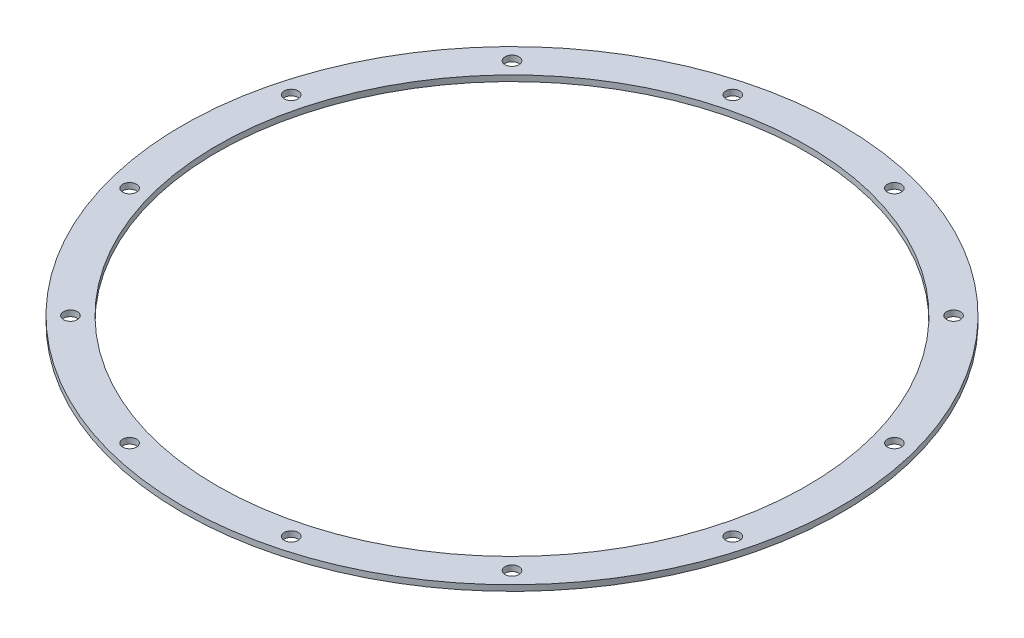
ISO-10303-21;
HEADER;
FILE_DESCRIPTION(('STEP AP214'),'2;1');
FILE_NAME('part.step','',(''),(''),'','','');
FILE_SCHEMA(('AUTOMOTIVE_DESIGN { 1 0 10303 214 1 1 1 1 }'));
ENDSEC;
DATA;
#1=APPLICATION_CONTEXT('core data for automotive mechanical design processes');
#2=APPLICATION_PROTOCOL_DEFINITION('international standard','automotive_design',2000,#1);
#3=PRODUCT_CONTEXT('',#1,'mechanical');
#4=PRODUCT('Part','Part','',(#3));
#5=PRODUCT_RELATED_PRODUCT_CATEGORY('part','',(#4));
#6=PRODUCT_DEFINITION_FORMATION('','',#4);
#7=PRODUCT_DEFINITION_CONTEXT('part definition',#1,'design');
#8=PRODUCT_DEFINITION('design','',#6,#7);
#9=PRODUCT_DEFINITION_SHAPE('','',#8);
#10=(LENGTH_UNIT() NAMED_UNIT(*) SI_UNIT(.MILLI.,.METRE.));
#11=(NAMED_UNIT(*) PLANE_ANGLE_UNIT() SI_UNIT($,.RADIAN.));
#12=(NAMED_UNIT(*) SI_UNIT($,.STERADIAN.) SOLID_ANGLE_UNIT());
#13=UNCERTAINTY_MEASURE_WITH_UNIT(LENGTH_MEASURE(1.E-05),#10,'distance_accuracy_value','');
#14=(GEOMETRIC_REPRESENTATION_CONTEXT(3) GLOBAL_UNCERTAINTY_ASSIGNED_CONTEXT((#13)) GLOBAL_UNIT_ASSIGNED_CONTEXT((#10,
#11,#12)) REPRESENTATION_CONTEXT('',''));
#15=CARTESIAN_POINT('',(0.,0.,0.));
#16=DIRECTION('',(0.,0.,1.));
#17=DIRECTION('',(1.,0.,0.));
#18=AXIS2_PLACEMENT_3D('',#15,#16,#17);
#19=CARTESIAN_POINT('',(0.,2.5,0.));
#20=DIRECTION('',(0.,1.,0.));
#21=DIRECTION('',(0.,0.,1.));
#22=AXIS2_PLACEMENT_3D('',#19,#20,#21);
#23=PLANE('',#22);
#24=CARTESIAN_POINT('',(-190.918830920357,2.5,190.918830920365));
#25=DIRECTION('',(0.,1.,0.));
#26=DIRECTION('',(0.,0.,1.));
#27=AXIS2_PLACEMENT_3D('',#24,#25,#26);
#28=CIRCLE('',#27,5.9999999999965);
#29=CARTESIAN_POINT('',(-190.918830920357,2.5,196.918830920362));
#30=VERTEX_POINT('',#29);
#31=EDGE_CURVE('E108',#30,#30,#28,.T.);
#32=ORIENTED_EDGE('',*,*,#31,.F.);
#33=EDGE_LOOP('',(#32));
#34=FACE_BOUND('',#33,.T.);
#35=CARTESIAN_POINT('',(69.8811421776947,2.5,260.799973098035));
#36=DIRECTION('',(0.,1.,0.));
#37=DIRECTION('',(0.,0.,1.));
#38=AXIS2_PLACEMENT_3D('',#35,#36,#37);
#39=CIRCLE('',#38,6.00000000000223);
#40=CARTESIAN_POINT('',(69.8811421776947,2.5,266.799973098037));
#41=VERTEX_POINT('',#40);
#42=EDGE_CURVE('E96',#41,#41,#39,.T.);
#43=ORIENTED_EDGE('',*,*,#42,.F.);
#44=EDGE_LOOP('',(#43));
#45=FACE_BOUND('',#44,.T.);
#46=CARTESIAN_POINT('',(260.799973098055,2.5,69.8811421776587));
#47=DIRECTION('',(0.,1.,0.));
#48=DIRECTION('',(0.,0.,1.));
#49=AXIS2_PLACEMENT_3D('',#46,#47,#48);
#50=CIRCLE('',#49,6.00000000001319);
#51=CARTESIAN_POINT('',(260.799973098055,2.5,75.8811421776718));
#52=VERTEX_POINT('',#51);
#53=EDGE_CURVE('E84',#52,#52,#50,.T.);
#54=ORIENTED_EDGE('',*,*,#53,.F.);
#55=EDGE_LOOP('',(#54));
#56=FACE_BOUND('',#55,.T.);
#57=CARTESIAN_POINT('',(190.918830920363,2.5,-190.918830920387));
#58=DIRECTION('',(0.,1.,0.));
#59=DIRECTION('',(0.,0.,1.));
#60=AXIS2_PLACEMENT_3D('',#57,#58,#59);
#61=CIRCLE('',#60,6.00000000001827);
#62=CARTESIAN_POINT('',(190.918830920363,2.5,-184.918830920369));
#63=VERTEX_POINT('',#62);
#64=EDGE_CURVE('E72',#63,#63,#61,.T.);
#65=ORIENTED_EDGE('',*,*,#64,.F.);
#66=EDGE_LOOP('',(#65));
#67=FACE_BOUND('',#66,.T.);
#68=CARTESIAN_POINT('',(-69.8811421776885,2.5,-260.799973098057));
#69=DIRECTION('',(0.,1.,0.));
#70=DIRECTION('',(0.,0.,1.));
#71=AXIS2_PLACEMENT_3D('',#68,#69,#70);
#72=CIRCLE('',#71,6.00000000001176);
#73=CARTESIAN_POINT('',(-69.8811421776885,2.5,-254.799973098045));
#74=VERTEX_POINT('',#73);
#75=EDGE_CURVE('E60',#74,#74,#72,.T.);
#76=ORIENTED_EDGE('',*,*,#75,.F.);
#77=EDGE_LOOP('',(#76));
#78=FACE_BOUND('',#77,.T.);
#79=CARTESIAN_POINT('',(-260.799973098048,2.5,-69.8811421776808));
#80=DIRECTION('',(0.,1.,0.));
#81=DIRECTION('',(0.,0.,1.));
#82=AXIS2_PLACEMENT_3D('',#79,#80,#81);
#83=CIRCLE('',#82,5.99999999999999);
#84=CARTESIAN_POINT('',(-260.799973098048,2.5,-63.8811421776808));
#85=VERTEX_POINT('',#84);
#86=EDGE_CURVE('E48',#85,#85,#83,.T.);
#87=ORIENTED_EDGE('',*,*,#86,.F.);
#88=EDGE_LOOP('',(#87));
#89=FACE_BOUND('',#88,.T.);
#90=CARTESIAN_POINT('',(0.,2.5,0.));
#91=DIRECTION('',(0.,1.,0.));
#92=DIRECTION('',(0.,0.,1.));
#93=AXIS2_PLACEMENT_3D('',#90,#91,#92);
#94=CIRCLE('',#93,285.);
#95=CARTESIAN_POINT('',(0.,2.5,285.));
#96=VERTEX_POINT('',#95);
#97=EDGE_CURVE('E10',#96,#96,#94,.T.);
#98=ORIENTED_EDGE('',*,*,#97,.T.);
#99=EDGE_LOOP('',(#98));
#100=FACE_BOUND('',#99,.T.);
#101=CARTESIAN_POINT('',(0.,2.5,0.));
#102=DIRECTION('',(0.,1.,0.));
#103=DIRECTION('',(0.,0.,1.));
#104=AXIS2_PLACEMENT_3D('',#101,#102,#103);
#105=CIRCLE('',#104,255.);
#106=CARTESIAN_POINT('',(0.,2.5,255.));
#107=VERTEX_POINT('',#106);
#108=EDGE_CURVE('E43',#107,#107,#105,.T.);
#109=ORIENTED_EDGE('',*,*,#108,.F.);
#110=EDGE_LOOP('',(#109));
#111=FACE_BOUND('',#110,.T.);
#112=CARTESIAN_POINT('',(-190.918830920373,2.5,-190.918830920371));
#113=DIRECTION('',(0.,1.,0.));
#114=DIRECTION('',(0.,0.,1.));
#115=AXIS2_PLACEMENT_3D('',#112,#113,#114);
#116=CIRCLE('',#115,6.00000000000574);
#117=CARTESIAN_POINT('',(-190.918830920373,2.5,-184.918830920365));
#118=VERTEX_POINT('',#117);
#119=EDGE_CURVE('E54',#118,#118,#116,.T.);
#120=ORIENTED_EDGE('',*,*,#119,.F.);
#121=EDGE_LOOP('',(#120));
#122=FACE_BOUND('',#121,.T.);
#123=CARTESIAN_POINT('',(69.8811421776728,2.5,-260.799973098063));
#124=DIRECTION('',(0.,1.,0.));
#125=DIRECTION('',(0.,0.,1.));
#126=AXIS2_PLACEMENT_3D('',#123,#124,#125);
#127=CIRCLE('',#126,6.00000000001627);
#128=CARTESIAN_POINT('',(69.8811421776728,2.5,-254.799973098046));
#129=VERTEX_POINT('',#128);
#130=EDGE_CURVE('E66',#129,#129,#127,.T.);
#131=ORIENTED_EDGE('',*,*,#130,.F.);
#132=EDGE_LOOP('',(#131));
#133=FACE_BOUND('',#132,.T.);
#134=CARTESIAN_POINT('',(260.799973098049,2.5,-69.8811421777027));
#135=DIRECTION('',(0.,1.,0.));
#136=DIRECTION('',(0.,0.,1.));
#137=AXIS2_PLACEMENT_3D('',#134,#135,#136);
#138=CIRCLE('',#137,6.00000000001721);
#139=CARTESIAN_POINT('',(260.799973098049,2.5,-63.8811421776855));
#140=VERTEX_POINT('',#139);
#141=EDGE_CURVE('E78',#140,#140,#138,.T.);
#142=ORIENTED_EDGE('',*,*,#141,.F.);
#143=EDGE_LOOP('',(#142));
#144=FACE_BOUND('',#143,.T.);
#145=CARTESIAN_POINT('',(190.918830920379,2.5,190.918830920349));
#146=DIRECTION('',(0.,1.,0.));
#147=DIRECTION('',(0.,0.,1.));
#148=AXIS2_PLACEMENT_3D('',#145,#146,#147);
#149=CIRCLE('',#148,6.00000000000784);
#150=CARTESIAN_POINT('',(190.918830920379,2.5,196.918830920357));
#151=VERTEX_POINT('',#150);
#152=EDGE_CURVE('E90',#151,#151,#149,.T.);
#153=ORIENTED_EDGE('',*,*,#152,.F.);
#154=EDGE_LOOP('',(#153));
#155=FACE_BOUND('',#154,.T.);
#156=CARTESIAN_POINT('',(-69.8811421776666,2.5,260.79997309804));
#157=DIRECTION('',(0.,1.,0.));
#158=DIRECTION('',(0.,0.,1.));
#159=AXIS2_PLACEMENT_3D('',#156,#157,#158);
#160=CIRCLE('',#159,5.99999999999795);
#161=CARTESIAN_POINT('',(-69.8811421776666,2.5,266.799973098038));
#162=VERTEX_POINT('',#161);
#163=EDGE_CURVE('E102',#162,#162,#160,.T.);
#164=ORIENTED_EDGE('',*,*,#163,.F.);
#165=EDGE_LOOP('',(#164));
#166=FACE_BOUND('',#165,.T.);
#167=CARTESIAN_POINT('',(-260.799973098042,2.5,69.8811421776806));
#168=DIRECTION('',(0.,1.,0.));
#169=DIRECTION('',(0.,0.,1.));
#170=AXIS2_PLACEMENT_3D('',#167,#168,#169);
#171=CIRCLE('',#170,5.99999999999784);
#172=CARTESIAN_POINT('',(-260.799973098042,2.5,75.8811421776785));
#173=VERTEX_POINT('',#172);
#174=EDGE_CURVE('E114',#173,#173,#171,.T.);
#175=ORIENTED_EDGE('',*,*,#174,.F.);
#176=EDGE_LOOP('',(#175));
#177=FACE_BOUND('',#176,.T.);
#178=ADVANCED_FACE('F32',(#34,#45,#56,#67,#78,#89,#100,#111,#122,#133,#144,#155,#166,#177),#23,.T.);
#179=CARTESIAN_POINT('',(0.,-2.5,0.));
#180=DIRECTION('',(0.,1.,0.));
#181=DIRECTION('',(0.,0.,1.));
#182=AXIS2_PLACEMENT_3D('',#179,#180,#181);
#183=PLANE('',#182);
#184=CARTESIAN_POINT('',(0.,-2.5,0.));
#185=DIRECTION('',(0.,1.,0.));
#186=DIRECTION('',(0.,0.,1.));
#187=AXIS2_PLACEMENT_3D('',#184,#185,#186);
#188=CIRCLE('',#187,285.);
#189=CARTESIAN_POINT('',(0.,-2.5,285.));
#190=VERTEX_POINT('',#189);
#191=EDGE_CURVE('E36',#190,#190,#188,.T.);
#192=ORIENTED_EDGE('',*,*,#191,.F.);
#193=EDGE_LOOP('',(#192));
#194=FACE_BOUND('',#193,.T.);
#195=CARTESIAN_POINT('',(0.,-2.5,0.));
#196=DIRECTION('',(0.,1.,0.));
#197=DIRECTION('',(0.,0.,1.));
#198=AXIS2_PLACEMENT_3D('',#195,#196,#197);
#199=CIRCLE('',#198,255.);
#200=CARTESIAN_POINT('',(0.,-2.5,255.));
#201=VERTEX_POINT('',#200);
#202=EDGE_CURVE('E45',#201,#201,#199,.T.);
#203=ORIENTED_EDGE('',*,*,#202,.T.);
#204=EDGE_LOOP('',(#203));
#205=FACE_BOUND('',#204,.T.);
#206=CARTESIAN_POINT('',(-260.799973098048,-2.5,-69.8811421776808));
#207=DIRECTION('',(0.,1.,0.));
#208=DIRECTION('',(0.,0.,1.));
#209=AXIS2_PLACEMENT_3D('',#206,#207,#208);
#210=CIRCLE('',#209,5.99999999999999);
#211=CARTESIAN_POINT('',(-260.799973098048,-2.5,-63.8811421776808));
#212=VERTEX_POINT('',#211);
#213=EDGE_CURVE('E51',#212,#212,#210,.T.);
#214=ORIENTED_EDGE('',*,*,#213,.T.);
#215=EDGE_LOOP('',(#214));
#216=FACE_BOUND('',#215,.T.);
#217=CARTESIAN_POINT('',(-190.918830920373,-2.5,-190.918830920371));
#218=DIRECTION('',(0.,1.,0.));
#219=DIRECTION('',(0.,0.,1.));
#220=AXIS2_PLACEMENT_3D('',#217,#218,#219);
#221=CIRCLE('',#220,6.00000000000574);
#222=CARTESIAN_POINT('',(-190.918830920373,-2.5,-184.918830920365));
#223=VERTEX_POINT('',#222);
#224=EDGE_CURVE('E57',#223,#223,#221,.T.);
#225=ORIENTED_EDGE('',*,*,#224,.T.);
#226=EDGE_LOOP('',(#225));
#227=FACE_BOUND('',#226,.T.);
#228=CARTESIAN_POINT('',(-69.8811421776885,-2.5,-260.799973098057));
#229=DIRECTION('',(0.,1.,0.));
#230=DIRECTION('',(0.,0.,1.));
#231=AXIS2_PLACEMENT_3D('',#228,#229,#230);
#232=CIRCLE('',#231,6.00000000001176);
#233=CARTESIAN_POINT('',(-69.8811421776885,-2.5,-254.799973098045));
#234=VERTEX_POINT('',#233);
#235=EDGE_CURVE('E63',#234,#234,#232,.T.);
#236=ORIENTED_EDGE('',*,*,#235,.T.);
#237=EDGE_LOOP('',(#236));
#238=FACE_BOUND('',#237,.T.);
#239=CARTESIAN_POINT('',(69.8811421776728,-2.5,-260.799973098063));
#240=DIRECTION('',(0.,1.,0.));
#241=DIRECTION('',(0.,0.,1.));
#242=AXIS2_PLACEMENT_3D('',#239,#240,#241);
#243=CIRCLE('',#242,6.00000000001627);
#244=CARTESIAN_POINT('',(69.8811421776728,-2.5,-254.799973098046));
#245=VERTEX_POINT('',#244);
#246=EDGE_CURVE('E69',#245,#245,#243,.T.);
#247=ORIENTED_EDGE('',*,*,#246,.T.);
#248=EDGE_LOOP('',(#247));
#249=FACE_BOUND('',#248,.T.);
#250=CARTESIAN_POINT('',(190.918830920363,-2.5,-190.918830920387));
#251=DIRECTION('',(0.,1.,0.));
#252=DIRECTION('',(0.,0.,1.));
#253=AXIS2_PLACEMENT_3D('',#250,#251,#252);
#254=CIRCLE('',#253,6.00000000001827);
#255=CARTESIAN_POINT('',(190.918830920363,-2.5,-184.918830920369));
#256=VERTEX_POINT('',#255);
#257=EDGE_CURVE('E75',#256,#256,#254,.T.);
#258=ORIENTED_EDGE('',*,*,#257,.T.);
#259=EDGE_LOOP('',(#258));
#260=FACE_BOUND('',#259,.T.);
#261=CARTESIAN_POINT('',(260.799973098049,-2.5,-69.8811421777027));
#262=DIRECTION('',(0.,1.,0.));
#263=DIRECTION('',(0.,0.,1.));
#264=AXIS2_PLACEMENT_3D('',#261,#262,#263);
#265=CIRCLE('',#264,6.00000000001721);
#266=CARTESIAN_POINT('',(260.799973098049,-2.5,-63.8811421776855));
#267=VERTEX_POINT('',#266);
#268=EDGE_CURVE('E81',#267,#267,#265,.T.);
#269=ORIENTED_EDGE('',*,*,#268,.T.);
#270=EDGE_LOOP('',(#269));
#271=FACE_BOUND('',#270,.T.);
#272=CARTESIAN_POINT('',(260.799973098055,-2.5,69.8811421776587));
#273=DIRECTION('',(0.,1.,0.));
#274=DIRECTION('',(0.,0.,1.));
#275=AXIS2_PLACEMENT_3D('',#272,#273,#274);
#276=CIRCLE('',#275,6.00000000001319);
#277=CARTESIAN_POINT('',(260.799973098055,-2.5,75.8811421776718));
#278=VERTEX_POINT('',#277);
#279=EDGE_CURVE('E87',#278,#278,#276,.T.);
#280=ORIENTED_EDGE('',*,*,#279,.T.);
#281=EDGE_LOOP('',(#280));
#282=FACE_BOUND('',#281,.T.);
#283=CARTESIAN_POINT('',(190.918830920379,-2.5,190.918830920349));
#284=DIRECTION('',(0.,1.,0.));
#285=DIRECTION('',(0.,0.,1.));
#286=AXIS2_PLACEMENT_3D('',#283,#284,#285);
#287=CIRCLE('',#286,6.00000000000784);
#288=CARTESIAN_POINT('',(190.918830920379,-2.5,196.918830920357));
#289=VERTEX_POINT('',#288);
#290=EDGE_CURVE('E93',#289,#289,#287,.T.);
#291=ORIENTED_EDGE('',*,*,#290,.T.);
#292=EDGE_LOOP('',(#291));
#293=FACE_BOUND('',#292,.T.);
#294=CARTESIAN_POINT('',(69.8811421776947,-2.5,260.799973098035));
#295=DIRECTION('',(0.,1.,0.));
#296=DIRECTION('',(0.,0.,1.));
#297=AXIS2_PLACEMENT_3D('',#294,#295,#296);
#298=CIRCLE('',#297,6.00000000000223);
#299=CARTESIAN_POINT('',(69.8811421776947,-2.5,266.799973098037));
#300=VERTEX_POINT('',#299);
#301=EDGE_CURVE('E99',#300,#300,#298,.T.);
#302=ORIENTED_EDGE('',*,*,#301,.T.);
#303=EDGE_LOOP('',(#302));
#304=FACE_BOUND('',#303,.T.);
#305=CARTESIAN_POINT('',(-69.8811421776666,-2.5,260.79997309804));
#306=DIRECTION('',(0.,1.,0.));
#307=DIRECTION('',(0.,0.,1.));
#308=AXIS2_PLACEMENT_3D('',#305,#306,#307);
#309=CIRCLE('',#308,5.99999999999795);
#310=CARTESIAN_POINT('',(-69.8811421776666,-2.5,266.799973098038));
#311=VERTEX_POINT('',#310);
#312=EDGE_CURVE('E105',#311,#311,#309,.T.);
#313=ORIENTED_EDGE('',*,*,#312,.T.);
#314=EDGE_LOOP('',(#313));
#315=FACE_BOUND('',#314,.T.);
#316=CARTESIAN_POINT('',(-190.918830920357,-2.5,190.918830920365));
#317=DIRECTION('',(0.,1.,0.));
#318=DIRECTION('',(0.,0.,1.));
#319=AXIS2_PLACEMENT_3D('',#316,#317,#318);
#320=CIRCLE('',#319,5.9999999999965);
#321=CARTESIAN_POINT('',(-190.918830920357,-2.5,196.918830920362));
#322=VERTEX_POINT('',#321);
#323=EDGE_CURVE('E111',#322,#322,#320,.T.);
#324=ORIENTED_EDGE('',*,*,#323,.T.);
#325=EDGE_LOOP('',(#324));
#326=FACE_BOUND('',#325,.T.);
#327=CARTESIAN_POINT('',(-260.799973098042,-2.5,69.8811421776806));
#328=DIRECTION('',(0.,1.,0.));
#329=DIRECTION('',(0.,0.,1.));
#330=AXIS2_PLACEMENT_3D('',#327,#328,#329);
#331=CIRCLE('',#330,5.99999999999784);
#332=CARTESIAN_POINT('',(-260.799973098042,-2.5,75.8811421776785));
#333=VERTEX_POINT('',#332);
#334=EDGE_CURVE('E117',#333,#333,#331,.T.);
#335=ORIENTED_EDGE('',*,*,#334,.T.);
#336=EDGE_LOOP('',(#335));
#337=FACE_BOUND('',#336,.T.);
#338=ADVANCED_FACE('F127',(#194,#205,#216,#227,#238,#249,#260,#271,#282,#293,#304,#315,#326,
#337),#183,.F.);
#339=CARTESIAN_POINT('',(0.,2.5,0.));
#340=DIRECTION('',(0.,-1.,0.));
#341=DIRECTION('',(0.,0.,-1.));
#342=AXIS2_PLACEMENT_3D('',#339,#340,#341);
#343=CYLINDRICAL_SURFACE('',#342,285.);
#344=ORIENTED_EDGE('',*,*,#191,.T.);
#345=EDGE_LOOP('',(#344));
#346=FACE_BOUND('',#345,.T.);
#347=ORIENTED_EDGE('',*,*,#97,.F.);
#348=EDGE_LOOP('',(#347));
#349=FACE_BOUND('',#348,.T.);
#350=ADVANCED_FACE('F34',(#346,#349),#343,.T.);
#351=CARTESIAN_POINT('',(0.,2.5,0.));
#352=DIRECTION('',(0.,-1.,0.));
#353=DIRECTION('',(0.,0.,-1.));
#354=AXIS2_PLACEMENT_3D('',#351,#352,#353);
#355=CYLINDRICAL_SURFACE('',#354,255.);
#356=ORIENTED_EDGE('',*,*,#108,.T.);
#357=EDGE_LOOP('',(#356));
#358=FACE_BOUND('',#357,.T.);
#359=ORIENTED_EDGE('',*,*,#202,.F.);
#360=EDGE_LOOP('',(#359));
#361=FACE_BOUND('',#360,.T.);
#362=ADVANCED_FACE('F137',(#358,#361),#355,.F.);
#363=CARTESIAN_POINT('',(-260.799973098048,2.5,-69.8811421776808));
#364=DIRECTION('',(0.,-1.,0.));
#365=DIRECTION('',(0.,0.,-1.));
#366=AXIS2_PLACEMENT_3D('',#363,#364,#365);
#367=CYLINDRICAL_SURFACE('',#366,5.99999999999999);
#368=ORIENTED_EDGE('',*,*,#86,.T.);
#369=EDGE_LOOP('',(#368));
#370=FACE_BOUND('',#369,.T.);
#371=ORIENTED_EDGE('',*,*,#213,.F.);
#372=EDGE_LOOP('',(#371));
#373=FACE_BOUND('',#372,.T.);
#374=ADVANCED_FACE('F140',(#370,#373),#367,.F.);
#375=CARTESIAN_POINT('',(-190.918830920373,2.5,-190.918830920371));
#376=DIRECTION('',(0.,-1.,0.));
#377=DIRECTION('',(0.,0.,-1.));
#378=AXIS2_PLACEMENT_3D('',#375,#376,#377);
#379=CYLINDRICAL_SURFACE('',#378,6.00000000000574);
#380=ORIENTED_EDGE('',*,*,#119,.T.);
#381=EDGE_LOOP('',(#380));
#382=FACE_BOUND('',#381,.T.);
#383=ORIENTED_EDGE('',*,*,#224,.F.);
#384=EDGE_LOOP('',(#383));
#385=FACE_BOUND('',#384,.T.);
#386=ADVANCED_FACE('F144',(#382,#385),#379,.F.);
#387=CARTESIAN_POINT('',(-69.8811421776885,2.5,-260.799973098057));
#388=DIRECTION('',(0.,-1.,0.));
#389=DIRECTION('',(0.,0.,-1.));
#390=AXIS2_PLACEMENT_3D('',#387,#388,#389);
#391=CYLINDRICAL_SURFACE('',#390,6.00000000001176);
#392=ORIENTED_EDGE('',*,*,#75,.T.);
#393=EDGE_LOOP('',(#392));
#394=FACE_BOUND('',#393,.T.);
#395=ORIENTED_EDGE('',*,*,#235,.F.);
#396=EDGE_LOOP('',(#395));
#397=FACE_BOUND('',#396,.T.);
#398=ADVANCED_FACE('F148',(#394,#397),#391,.F.);
#399=CARTESIAN_POINT('',(69.8811421776728,2.5,-260.799973098063));
#400=DIRECTION('',(0.,-1.,0.));
#401=DIRECTION('',(0.,0.,-1.));
#402=AXIS2_PLACEMENT_3D('',#399,#400,#401);
#403=CYLINDRICAL_SURFACE('',#402,6.00000000001627);
#404=ORIENTED_EDGE('',*,*,#130,.T.);
#405=EDGE_LOOP('',(#404));
#406=FACE_BOUND('',#405,.T.);
#407=ORIENTED_EDGE('',*,*,#246,.F.);
#408=EDGE_LOOP('',(#407));
#409=FACE_BOUND('',#408,.T.);
#410=ADVANCED_FACE('F152',(#406,#409),#403,.F.);
#411=CARTESIAN_POINT('',(190.918830920363,2.5,-190.918830920387));
#412=DIRECTION('',(0.,-1.,0.));
#413=DIRECTION('',(0.,0.,-1.));
#414=AXIS2_PLACEMENT_3D('',#411,#412,#413);
#415=CYLINDRICAL_SURFACE('',#414,6.00000000001827);
#416=ORIENTED_EDGE('',*,*,#64,.T.);
#417=EDGE_LOOP('',(#416));
#418=FACE_BOUND('',#417,.T.);
#419=ORIENTED_EDGE('',*,*,#257,.F.);
#420=EDGE_LOOP('',(#419));
#421=FACE_BOUND('',#420,.T.);
#422=ADVANCED_FACE('F156',(#418,#421),#415,.F.);
#423=CARTESIAN_POINT('',(260.799973098049,2.5,-69.8811421777027));
#424=DIRECTION('',(0.,-1.,0.));
#425=DIRECTION('',(0.,0.,-1.));
#426=AXIS2_PLACEMENT_3D('',#423,#424,#425);
#427=CYLINDRICAL_SURFACE('',#426,6.00000000001721);
#428=ORIENTED_EDGE('',*,*,#141,.T.);
#429=EDGE_LOOP('',(#428));
#430=FACE_BOUND('',#429,.T.);
#431=ORIENTED_EDGE('',*,*,#268,.F.);
#432=EDGE_LOOP('',(#431));
#433=FACE_BOUND('',#432,.T.);
#434=ADVANCED_FACE('F160',(#430,#433),#427,.F.);
#435=CARTESIAN_POINT('',(260.799973098055,2.5,69.8811421776587));
#436=DIRECTION('',(0.,-1.,0.));
#437=DIRECTION('',(0.,0.,-1.));
#438=AXIS2_PLACEMENT_3D('',#435,#436,#437);
#439=CYLINDRICAL_SURFACE('',#438,6.00000000001319);
#440=ORIENTED_EDGE('',*,*,#53,.T.);
#441=EDGE_LOOP('',(#440));
#442=FACE_BOUND('',#441,.T.);
#443=ORIENTED_EDGE('',*,*,#279,.F.);
#444=EDGE_LOOP('',(#443));
#445=FACE_BOUND('',#444,.T.);
#446=ADVANCED_FACE('F164',(#442,#445),#439,.F.);
#447=CARTESIAN_POINT('',(190.918830920379,2.5,190.918830920349));
#448=DIRECTION('',(0.,-1.,0.));
#449=DIRECTION('',(0.,0.,-1.));
#450=AXIS2_PLACEMENT_3D('',#447,#448,#449);
#451=CYLINDRICAL_SURFACE('',#450,6.00000000000784);
#452=ORIENTED_EDGE('',*,*,#152,.T.);
#453=EDGE_LOOP('',(#452));
#454=FACE_BOUND('',#453,.T.);
#455=ORIENTED_EDGE('',*,*,#290,.F.);
#456=EDGE_LOOP('',(#455));
#457=FACE_BOUND('',#456,.T.);
#458=ADVANCED_FACE('F168',(#454,#457),#451,.F.);
#459=CARTESIAN_POINT('',(69.8811421776947,2.5,260.799973098035));
#460=DIRECTION('',(0.,-1.,0.));
#461=DIRECTION('',(0.,0.,-1.));
#462=AXIS2_PLACEMENT_3D('',#459,#460,#461);
#463=CYLINDRICAL_SURFACE('',#462,6.00000000000223);
#464=ORIENTED_EDGE('',*,*,#42,.T.);
#465=EDGE_LOOP('',(#464));
#466=FACE_BOUND('',#465,.T.);
#467=ORIENTED_EDGE('',*,*,#301,.F.);
#468=EDGE_LOOP('',(#467));
#469=FACE_BOUND('',#468,.T.);
#470=ADVANCED_FACE('F172',(#466,#469),#463,.F.);
#471=CARTESIAN_POINT('',(-69.8811421776666,2.5,260.79997309804));
#472=DIRECTION('',(0.,-1.,0.));
#473=DIRECTION('',(0.,0.,-1.));
#474=AXIS2_PLACEMENT_3D('',#471,#472,#473);
#475=CYLINDRICAL_SURFACE('',#474,5.99999999999795);
#476=ORIENTED_EDGE('',*,*,#163,.T.);
#477=EDGE_LOOP('',(#476));
#478=FACE_BOUND('',#477,.T.);
#479=ORIENTED_EDGE('',*,*,#312,.F.);
#480=EDGE_LOOP('',(#479));
#481=FACE_BOUND('',#480,.T.);
#482=ADVANCED_FACE('F176',(#478,#481),#475,.F.);
#483=CARTESIAN_POINT('',(-190.918830920357,2.5,190.918830920365));
#484=DIRECTION('',(0.,-1.,0.));
#485=DIRECTION('',(0.,0.,-1.));
#486=AXIS2_PLACEMENT_3D('',#483,#484,#485);
#487=CYLINDRICAL_SURFACE('',#486,5.9999999999965);
#488=ORIENTED_EDGE('',*,*,#31,.T.);
#489=EDGE_LOOP('',(#488));
#490=FACE_BOUND('',#489,.T.);
#491=ORIENTED_EDGE('',*,*,#323,.F.);
#492=EDGE_LOOP('',(#491));
#493=FACE_BOUND('',#492,.T.);
#494=ADVANCED_FACE('F180',(#490,#493),#487,.F.);
#495=CARTESIAN_POINT('',(-260.799973098042,2.5,69.8811421776806));
#496=DIRECTION('',(0.,-1.,0.));
#497=DIRECTION('',(0.,0.,-1.));
#498=AXIS2_PLACEMENT_3D('',#495,#496,#497);
#499=CYLINDRICAL_SURFACE('',#498,5.99999999999784);
#500=ORIENTED_EDGE('',*,*,#174,.T.);
#501=EDGE_LOOP('',(#500));
#502=FACE_BOUND('',#501,.T.);
#503=ORIENTED_EDGE('',*,*,#334,.F.);
#504=EDGE_LOOP('',(#503));
#505=FACE_BOUND('',#504,.T.);
#506=ADVANCED_FACE('F123',(#502,#505),#499,.F.);
#507=CLOSED_SHELL('',(#178,#338,#350,#362,#374,#386,#398,#410,#422,#434,#446,#458,#470,#482,
#494,#506));
#508=MANIFOLD_SOLID_BREP('B2',#507);
#509=ADVANCED_BREP_SHAPE_REPRESENTATION('',(#18,#508),#14);
#510=SHAPE_DEFINITION_REPRESENTATION(#9,#509);
ENDSEC;
END-ISO-10303-21;
